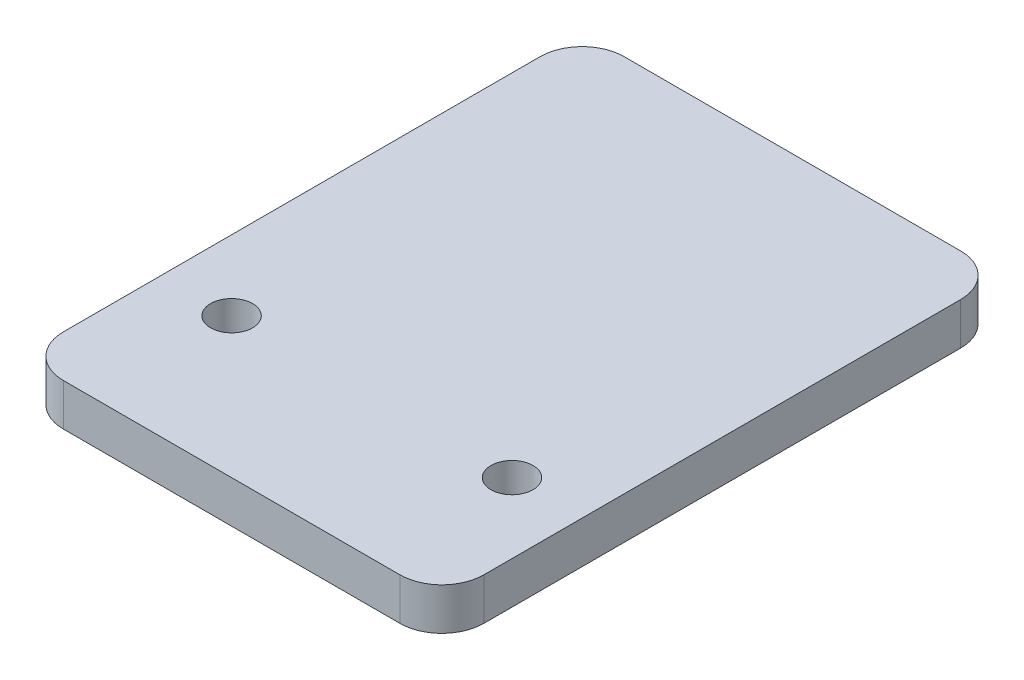
ISO-10303-21;
HEADER;
FILE_DESCRIPTION(('STEP AP214'),'2;1');
FILE_NAME('part.step','',(''),(''),'','','');
FILE_SCHEMA(('AUTOMOTIVE_DESIGN { 1 0 10303 214 1 1 1 1 }'));
ENDSEC;
DATA;
#1=APPLICATION_CONTEXT('core data for automotive mechanical design processes');
#2=APPLICATION_PROTOCOL_DEFINITION('international standard','automotive_design',2000,#1);
#3=PRODUCT_CONTEXT('',#1,'mechanical');
#4=PRODUCT('Part','Part','',(#3));
#5=PRODUCT_RELATED_PRODUCT_CATEGORY('part','',(#4));
#6=PRODUCT_DEFINITION_FORMATION('','',#4);
#7=PRODUCT_DEFINITION_CONTEXT('part definition',#1,'design');
#8=PRODUCT_DEFINITION('design','',#6,#7);
#9=PRODUCT_DEFINITION_SHAPE('','',#8);
#10=(LENGTH_UNIT() NAMED_UNIT(*) SI_UNIT(.MILLI.,.METRE.));
#11=(NAMED_UNIT(*) PLANE_ANGLE_UNIT() SI_UNIT($,.RADIAN.));
#12=(NAMED_UNIT(*) SI_UNIT($,.STERADIAN.) SOLID_ANGLE_UNIT());
#13=UNCERTAINTY_MEASURE_WITH_UNIT(LENGTH_MEASURE(1.E-05),#10,'distance_accuracy_value','');
#14=(GEOMETRIC_REPRESENTATION_CONTEXT(3) GLOBAL_UNCERTAINTY_ASSIGNED_CONTEXT((#13)) GLOBAL_UNIT_ASSIGNED_CONTEXT((#10,
#11,#12)) REPRESENTATION_CONTEXT('',''));
#15=CARTESIAN_POINT('',(0.,0.,0.));
#16=DIRECTION('',(0.,0.,1.));
#17=DIRECTION('',(1.,0.,0.));
#18=AXIS2_PLACEMENT_3D('',#15,#16,#17);
#19=CARTESIAN_POINT('',(15.,3.,20.));
#20=DIRECTION('',(-1.,0.,0.));
#21=DIRECTION('',(0.,0.,1.));
#22=AXIS2_PLACEMENT_3D('',#19,#20,#21);
#23=PLANE('',#22);
#24=DIRECTION('',(0.,0.,-1.));
#25=VECTOR('',#24,1.);
#26=CARTESIAN_POINT('',(15.,3.,20.));
#27=LINE('',#26,#25);
#28=CARTESIAN_POINT('',(15.,3.,17.));
#29=VERTEX_POINT('',#28);
#30=CARTESIAN_POINT('',(15.,3.,-17.));
#31=VERTEX_POINT('',#30);
#32=EDGE_CURVE('E121',#29,#31,#27,.T.);
#33=ORIENTED_EDGE('',*,*,#32,.F.);
#34=DIRECTION('',(0.,-1.,0.));
#35=VECTOR('',#34,1.);
#36=CARTESIAN_POINT('',(15.,3.,17.));
#37=LINE('',#36,#35);
#38=CARTESIAN_POINT('',(15.,0.,17.));
#39=VERTEX_POINT('',#38);
#40=EDGE_CURVE('E106',#29,#39,#37,.T.);
#41=ORIENTED_EDGE('',*,*,#40,.T.);
#42=DIRECTION('',(0.,0.,-1.));
#43=VECTOR('',#42,1.);
#44=CARTESIAN_POINT('',(15.,0.,20.));
#45=LINE('',#44,#43);
#46=CARTESIAN_POINT('',(15.,0.,-17.));
#47=VERTEX_POINT('',#46);
#48=EDGE_CURVE('E118',#39,#47,#45,.T.);
#49=ORIENTED_EDGE('',*,*,#48,.T.);
#50=DIRECTION('',(0.,-1.,0.));
#51=VECTOR('',#50,1.);
#52=CARTESIAN_POINT('',(15.,3.,-17.));
#53=LINE('',#52,#51);
#54=EDGE_CURVE('E123',#47,#31,#53,.F.);
#55=ORIENTED_EDGE('',*,*,#54,.T.);
#56=EDGE_LOOP('',(#33,#41,#49,#55));
#57=FACE_BOUND('',#56,.T.);
#58=ADVANCED_FACE('F35',(#57),#23,.F.);
#59=CARTESIAN_POINT('',(-15.,3.,-20.));
#60=DIRECTION('',(0.,0.,1.));
#61=DIRECTION('',(1.,0.,0.));
#62=AXIS2_PLACEMENT_3D('',#59,#60,#61);
#63=PLANE('',#62);
#64=DIRECTION('',(-1.,0.,0.));
#65=VECTOR('',#64,1.);
#66=CARTESIAN_POINT('',(-15.,3.,-20.));
#67=LINE('',#66,#65);
#68=CARTESIAN_POINT('',(12.,3.,-20.));
#69=VERTEX_POINT('',#68);
#70=CARTESIAN_POINT('',(-12.,3.,-20.));
#71=VERTEX_POINT('',#70);
#72=EDGE_CURVE('E165',#69,#71,#67,.T.);
#73=ORIENTED_EDGE('',*,*,#72,.F.);
#74=DIRECTION('',(0.,-1.,0.));
#75=VECTOR('',#74,1.);
#76=CARTESIAN_POINT('',(12.,3.,-20.));
#77=LINE('',#76,#75);
#78=CARTESIAN_POINT('',(12.,0.,-20.));
#79=VERTEX_POINT('',#78);
#80=EDGE_CURVE('E11',#69,#79,#77,.T.);
#81=ORIENTED_EDGE('',*,*,#80,.T.);
#82=DIRECTION('',(-1.,0.,0.));
#83=VECTOR('',#82,1.);
#84=CARTESIAN_POINT('',(-15.,0.,-20.));
#85=LINE('',#84,#83);
#86=CARTESIAN_POINT('',(-12.,0.,-20.));
#87=VERTEX_POINT('',#86);
#88=EDGE_CURVE('E128',#79,#87,#85,.T.);
#89=ORIENTED_EDGE('',*,*,#88,.T.);
#90=DIRECTION('',(0.,-1.,0.));
#91=VECTOR('',#90,1.);
#92=CARTESIAN_POINT('',(-12.,3.,-20.));
#93=LINE('',#92,#91);
#94=EDGE_CURVE('E43',#87,#71,#93,.F.);
#95=ORIENTED_EDGE('',*,*,#94,.T.);
#96=EDGE_LOOP('',(#73,#81,#89,#95));
#97=FACE_BOUND('',#96,.T.);
#98=ADVANCED_FACE('F164',(#97),#63,.F.);
#99=CARTESIAN_POINT('',(-15.,3.,20.));
#100=DIRECTION('',(1.,0.,0.));
#101=DIRECTION('',(0.,0.,-1.));
#102=AXIS2_PLACEMENT_3D('',#99,#100,#101);
#103=PLANE('',#102);
#104=DIRECTION('',(0.,0.,1.));
#105=VECTOR('',#104,1.);
#106=CARTESIAN_POINT('',(-15.,0.,20.));
#107=LINE('',#106,#105);
#108=CARTESIAN_POINT('',(-15.,0.,-17.));
#109=VERTEX_POINT('',#108);
#110=CARTESIAN_POINT('',(-15.,0.,17.));
#111=VERTEX_POINT('',#110);
#112=EDGE_CURVE('E132',#109,#111,#107,.T.);
#113=ORIENTED_EDGE('',*,*,#112,.T.);
#114=DIRECTION('',(0.,-1.,0.));
#115=VECTOR('',#114,1.);
#116=CARTESIAN_POINT('',(-15.,3.,17.));
#117=LINE('',#116,#115);
#118=CARTESIAN_POINT('',(-15.,3.,17.));
#119=VERTEX_POINT('',#118);
#120=EDGE_CURVE('E50',#111,#119,#117,.F.);
#121=ORIENTED_EDGE('',*,*,#120,.T.);
#122=DIRECTION('',(0.,0.,1.));
#123=VECTOR('',#122,1.);
#124=CARTESIAN_POINT('',(-15.,3.,20.));
#125=LINE('',#124,#123);
#126=CARTESIAN_POINT('',(-15.,3.,-17.));
#127=VERTEX_POINT('',#126);
#128=EDGE_CURVE('E171',#127,#119,#125,.T.);
#129=ORIENTED_EDGE('',*,*,#128,.F.);
#130=DIRECTION('',(0.,-1.,0.));
#131=VECTOR('',#130,1.);
#132=CARTESIAN_POINT('',(-15.,3.,-17.));
#133=LINE('',#132,#131);
#134=EDGE_CURVE('E158',#127,#109,#133,.T.);
#135=ORIENTED_EDGE('',*,*,#134,.T.);
#136=EDGE_LOOP('',(#113,#121,#129,#135));
#137=FACE_BOUND('',#136,.T.);
#138=ADVANCED_FACE('F175',(#137),#103,.F.);
#139=CARTESIAN_POINT('',(-15.,3.,20.));
#140=DIRECTION('',(0.,0.,-1.));
#141=DIRECTION('',(-1.,0.,0.));
#142=AXIS2_PLACEMENT_3D('',#139,#140,#141);
#143=PLANE('',#142);
#144=DIRECTION('',(1.,0.,0.));
#145=VECTOR('',#144,1.);
#146=CARTESIAN_POINT('',(-15.,0.,20.));
#147=LINE('',#146,#145);
#148=CARTESIAN_POINT('',(-12.,0.,20.));
#149=VERTEX_POINT('',#148);
#150=CARTESIAN_POINT('',(12.,0.,20.));
#151=VERTEX_POINT('',#150);
#152=EDGE_CURVE('E142',#149,#151,#147,.T.);
#153=ORIENTED_EDGE('',*,*,#152,.T.);
#154=DIRECTION('',(0.,-1.,0.));
#155=VECTOR('',#154,1.);
#156=CARTESIAN_POINT('',(12.,3.,20.));
#157=LINE('',#156,#155);
#158=CARTESIAN_POINT('',(12.,3.,20.));
#159=VERTEX_POINT('',#158);
#160=EDGE_CURVE('E107',#151,#159,#157,.F.);
#161=ORIENTED_EDGE('',*,*,#160,.T.);
#162=DIRECTION('',(1.,0.,0.));
#163=VECTOR('',#162,1.);
#164=CARTESIAN_POINT('',(-15.,3.,20.));
#165=LINE('',#164,#163);
#166=CARTESIAN_POINT('',(-12.,3.,20.));
#167=VERTEX_POINT('',#166);
#168=EDGE_CURVE('E138',#167,#159,#165,.T.);
#169=ORIENTED_EDGE('',*,*,#168,.F.);
#170=DIRECTION('',(0.,-1.,0.));
#171=VECTOR('',#170,1.);
#172=CARTESIAN_POINT('',(-12.,3.,20.));
#173=LINE('',#172,#171);
#174=EDGE_CURVE('E112',#167,#149,#173,.T.);
#175=ORIENTED_EDGE('',*,*,#174,.T.);
#176=EDGE_LOOP('',(#153,#161,#169,#175));
#177=FACE_BOUND('',#176,.T.);
#178=ADVANCED_FACE('F182',(#177),#143,.F.);
#179=CARTESIAN_POINT('',(0.,3.,0.));
#180=DIRECTION('',(0.,-1.,0.));
#181=DIRECTION('',(0.,0.,-1.));
#182=AXIS2_PLACEMENT_3D('',#179,#180,#181);
#183=PLANE('',#182);
#184=CARTESIAN_POINT('',(-10.,3.,10.));
#185=DIRECTION('',(0.,1.,0.));
#186=DIRECTION('',(0.,0.,1.));
#187=AXIS2_PLACEMENT_3D('',#184,#185,#186);
#188=CIRCLE('',#187,1.5);
#189=CARTESIAN_POINT('',(-10.,3.,11.5));
#190=VERTEX_POINT('',#189);
#191=EDGE_CURVE('E135',#190,#190,#188,.T.);
#192=ORIENTED_EDGE('',*,*,#191,.F.);
#193=EDGE_LOOP('',(#192));
#194=FACE_BOUND('',#193,.T.);
#195=CARTESIAN_POINT('',(10.,3.,10.));
#196=DIRECTION('',(0.,1.,0.));
#197=DIRECTION('',(0.,0.,-1.));
#198=AXIS2_PLACEMENT_3D('',#195,#196,#197);
#199=CIRCLE('',#198,1.5);
#200=CARTESIAN_POINT('',(10.,3.,8.5));
#201=VERTEX_POINT('',#200);
#202=EDGE_CURVE('E185',#201,#201,#199,.T.);
#203=ORIENTED_EDGE('',*,*,#202,.F.);
#204=EDGE_LOOP('',(#203));
#205=FACE_BOUND('',#204,.T.);
#206=ORIENTED_EDGE('',*,*,#168,.T.);
#207=CARTESIAN_POINT('',(12.,3.,17.));
#208=DIRECTION('',(0.,-1.,0.));
#209=DIRECTION('',(0.,0.,-1.));
#210=AXIS2_PLACEMENT_3D('',#207,#208,#209);
#211=CIRCLE('',#210,3.);
#212=EDGE_CURVE('E156',#159,#29,#211,.F.);
#213=ORIENTED_EDGE('',*,*,#212,.T.);
#214=ORIENTED_EDGE('',*,*,#32,.T.);
#215=CARTESIAN_POINT('',(12.,3.,-17.));
#216=DIRECTION('',(0.,-1.,0.));
#217=DIRECTION('',(0.,0.,-1.));
#218=AXIS2_PLACEMENT_3D('',#215,#216,#217);
#219=CIRCLE('',#218,3.);
#220=EDGE_CURVE('E152',#31,#69,#219,.F.);
#221=ORIENTED_EDGE('',*,*,#220,.T.);
#222=ORIENTED_EDGE('',*,*,#72,.T.);
#223=CARTESIAN_POINT('',(-12.,3.,-17.));
#224=DIRECTION('',(0.,-1.,0.));
#225=DIRECTION('',(0.,0.,-1.));
#226=AXIS2_PLACEMENT_3D('',#223,#224,#225);
#227=CIRCLE('',#226,3.);
#228=EDGE_CURVE('E57',#71,#127,#227,.F.);
#229=ORIENTED_EDGE('',*,*,#228,.T.);
#230=ORIENTED_EDGE('',*,*,#128,.T.);
#231=CARTESIAN_POINT('',(-12.,3.,17.));
#232=DIRECTION('',(0.,-1.,0.));
#233=DIRECTION('',(0.,0.,-1.));
#234=AXIS2_PLACEMENT_3D('',#231,#232,#233);
#235=CIRCLE('',#234,3.);
#236=EDGE_CURVE('E154',#119,#167,#235,.F.);
#237=ORIENTED_EDGE('',*,*,#236,.T.);
#238=EDGE_LOOP('',(#206,#213,#214,#221,#222,#229,#230,#237));
#239=FACE_BOUND('',#238,.T.);
#240=ADVANCED_FACE('F169',(#194,#205,#239),#183,.F.);
#241=CARTESIAN_POINT('',(0.,0.,0.));
#242=DIRECTION('',(0.,-1.,0.));
#243=DIRECTION('',(0.,0.,-1.));
#244=AXIS2_PLACEMENT_3D('',#241,#242,#243);
#245=PLANE('',#244);
#246=CARTESIAN_POINT('',(-10.,0.,10.));
#247=DIRECTION('',(0.,1.,0.));
#248=DIRECTION('',(0.,0.,1.));
#249=AXIS2_PLACEMENT_3D('',#246,#247,#248);
#250=CIRCLE('',#249,1.5);
#251=CARTESIAN_POINT('',(-10.,0.,11.5));
#252=VERTEX_POINT('',#251);
#253=EDGE_CURVE('E129',#252,#252,#250,.T.);
#254=ORIENTED_EDGE('',*,*,#253,.T.);
#255=EDGE_LOOP('',(#254));
#256=FACE_BOUND('',#255,.T.);
#257=CARTESIAN_POINT('',(10.,0.,10.));
#258=DIRECTION('',(0.,1.,0.));
#259=DIRECTION('',(0.,0.,-1.));
#260=AXIS2_PLACEMENT_3D('',#257,#258,#259);
#261=CIRCLE('',#260,1.5);
#262=CARTESIAN_POINT('',(10.,0.,8.5));
#263=VERTEX_POINT('',#262);
#264=EDGE_CURVE('E188',#263,#263,#261,.T.);
#265=ORIENTED_EDGE('',*,*,#264,.T.);
#266=EDGE_LOOP('',(#265));
#267=FACE_BOUND('',#266,.T.);
#268=ORIENTED_EDGE('',*,*,#48,.F.);
#269=CARTESIAN_POINT('',(12.,0.,17.));
#270=DIRECTION('',(0.,-1.,0.));
#271=DIRECTION('',(0.,0.,-1.));
#272=AXIS2_PLACEMENT_3D('',#269,#270,#271);
#273=CIRCLE('',#272,3.);
#274=EDGE_CURVE('E102',#39,#151,#273,.T.);
#275=ORIENTED_EDGE('',*,*,#274,.T.);
#276=ORIENTED_EDGE('',*,*,#152,.F.);
#277=CARTESIAN_POINT('',(-12.,0.,17.));
#278=DIRECTION('',(0.,-1.,0.));
#279=DIRECTION('',(0.,0.,-1.));
#280=AXIS2_PLACEMENT_3D('',#277,#278,#279);
#281=CIRCLE('',#280,3.);
#282=EDGE_CURVE('E113',#149,#111,#281,.T.);
#283=ORIENTED_EDGE('',*,*,#282,.T.);
#284=ORIENTED_EDGE('',*,*,#112,.F.);
#285=CARTESIAN_POINT('',(-12.,0.,-17.));
#286=DIRECTION('',(0.,-1.,0.));
#287=DIRECTION('',(0.,0.,-1.));
#288=AXIS2_PLACEMENT_3D('',#285,#286,#287);
#289=CIRCLE('',#288,3.);
#290=EDGE_CURVE('E122',#109,#87,#289,.T.);
#291=ORIENTED_EDGE('',*,*,#290,.T.);
#292=ORIENTED_EDGE('',*,*,#88,.F.);
#293=CARTESIAN_POINT('',(12.,0.,-17.));
#294=DIRECTION('',(0.,-1.,0.));
#295=DIRECTION('',(0.,0.,-1.));
#296=AXIS2_PLACEMENT_3D('',#293,#294,#295);
#297=CIRCLE('',#296,3.);
#298=EDGE_CURVE('E127',#79,#47,#297,.T.);
#299=ORIENTED_EDGE('',*,*,#298,.T.);
#300=EDGE_LOOP('',(#268,#275,#276,#283,#284,#291,#292,#299));
#301=FACE_BOUND('',#300,.T.);
#302=ADVANCED_FACE('F125',(#256,#267,#301),#245,.T.);
#303=CARTESIAN_POINT('',(10.,0.,10.));
#304=DIRECTION('',(0.,1.,0.));
#305=DIRECTION('',(0.,0.,1.));
#306=AXIS2_PLACEMENT_3D('',#303,#304,#305);
#307=CYLINDRICAL_SURFACE('',#306,1.5);
#308=ORIENTED_EDGE('',*,*,#264,.F.);
#309=EDGE_LOOP('',(#308));
#310=FACE_BOUND('',#309,.T.);
#311=ORIENTED_EDGE('',*,*,#202,.T.);
#312=EDGE_LOOP('',(#311));
#313=FACE_BOUND('',#312,.T.);
#314=ADVANCED_FACE('F201',(#310,#313),#307,.F.);
#315=CARTESIAN_POINT('',(-10.,0.,10.));
#316=DIRECTION('',(0.,1.,0.));
#317=DIRECTION('',(0.,0.,1.));
#318=AXIS2_PLACEMENT_3D('',#315,#316,#317);
#319=CYLINDRICAL_SURFACE('',#318,1.5);
#320=ORIENTED_EDGE('',*,*,#253,.F.);
#321=EDGE_LOOP('',(#320));
#322=FACE_BOUND('',#321,.T.);
#323=ORIENTED_EDGE('',*,*,#191,.T.);
#324=EDGE_LOOP('',(#323));
#325=FACE_BOUND('',#324,.T.);
#326=ADVANCED_FACE('F194',(#322,#325),#319,.F.);
#327=CARTESIAN_POINT('',(12.,3.,17.));
#328=DIRECTION('',(0.,-1.,0.));
#329=DIRECTION('',(0.,0.,-1.));
#330=AXIS2_PLACEMENT_3D('',#327,#328,#329);
#331=CYLINDRICAL_SURFACE('',#330,3.);
#332=ORIENTED_EDGE('',*,*,#212,.F.);
#333=ORIENTED_EDGE('',*,*,#160,.F.);
#334=ORIENTED_EDGE('',*,*,#274,.F.);
#335=ORIENTED_EDGE('',*,*,#40,.F.);
#336=EDGE_LOOP('',(#332,#333,#334,#335));
#337=FACE_BOUND('',#336,.T.);
#338=ADVANCED_FACE('F105',(#337),#331,.T.);
#339=CARTESIAN_POINT('',(-12.,3.,17.));
#340=DIRECTION('',(0.,-1.,0.));
#341=DIRECTION('',(0.,0.,-1.));
#342=AXIS2_PLACEMENT_3D('',#339,#340,#341);
#343=CYLINDRICAL_SURFACE('',#342,3.);
#344=ORIENTED_EDGE('',*,*,#236,.F.);
#345=ORIENTED_EDGE('',*,*,#120,.F.);
#346=ORIENTED_EDGE('',*,*,#282,.F.);
#347=ORIENTED_EDGE('',*,*,#174,.F.);
#348=EDGE_LOOP('',(#344,#345,#346,#347));
#349=FACE_BOUND('',#348,.T.);
#350=ADVANCED_FACE('F179',(#349),#343,.T.);
#351=CARTESIAN_POINT('',(12.,3.,-17.));
#352=DIRECTION('',(0.,-1.,0.));
#353=DIRECTION('',(0.,0.,-1.));
#354=AXIS2_PLACEMENT_3D('',#351,#352,#353);
#355=CYLINDRICAL_SURFACE('',#354,3.);
#356=ORIENTED_EDGE('',*,*,#220,.F.);
#357=ORIENTED_EDGE('',*,*,#54,.F.);
#358=ORIENTED_EDGE('',*,*,#298,.F.);
#359=ORIENTED_EDGE('',*,*,#80,.F.);
#360=EDGE_LOOP('',(#356,#357,#358,#359));
#361=FACE_BOUND('',#360,.T.);
#362=ADVANCED_FACE('F225',(#361),#355,.T.);
#363=CARTESIAN_POINT('',(-12.,3.,-17.));
#364=DIRECTION('',(0.,-1.,0.));
#365=DIRECTION('',(0.,0.,-1.));
#366=AXIS2_PLACEMENT_3D('',#363,#364,#365);
#367=CYLINDRICAL_SURFACE('',#366,3.);
#368=ORIENTED_EDGE('',*,*,#228,.F.);
#369=ORIENTED_EDGE('',*,*,#94,.F.);
#370=ORIENTED_EDGE('',*,*,#290,.F.);
#371=ORIENTED_EDGE('',*,*,#134,.F.);
#372=EDGE_LOOP('',(#368,#369,#370,#371));
#373=FACE_BOUND('',#372,.T.);
#374=ADVANCED_FACE('F37',(#373),#367,.T.);
#375=CLOSED_SHELL('',(#58,#98,#138,#178,#240,#302,#314,#326,#338,#350,#362,#374));
#376=MANIFOLD_SOLID_BREP('B2',#375);
#377=ADVANCED_BREP_SHAPE_REPRESENTATION('',(#18,#376),#14);
#378=SHAPE_DEFINITION_REPRESENTATION(#9,#377);
ENDSEC;
END-ISO-10303-21;
